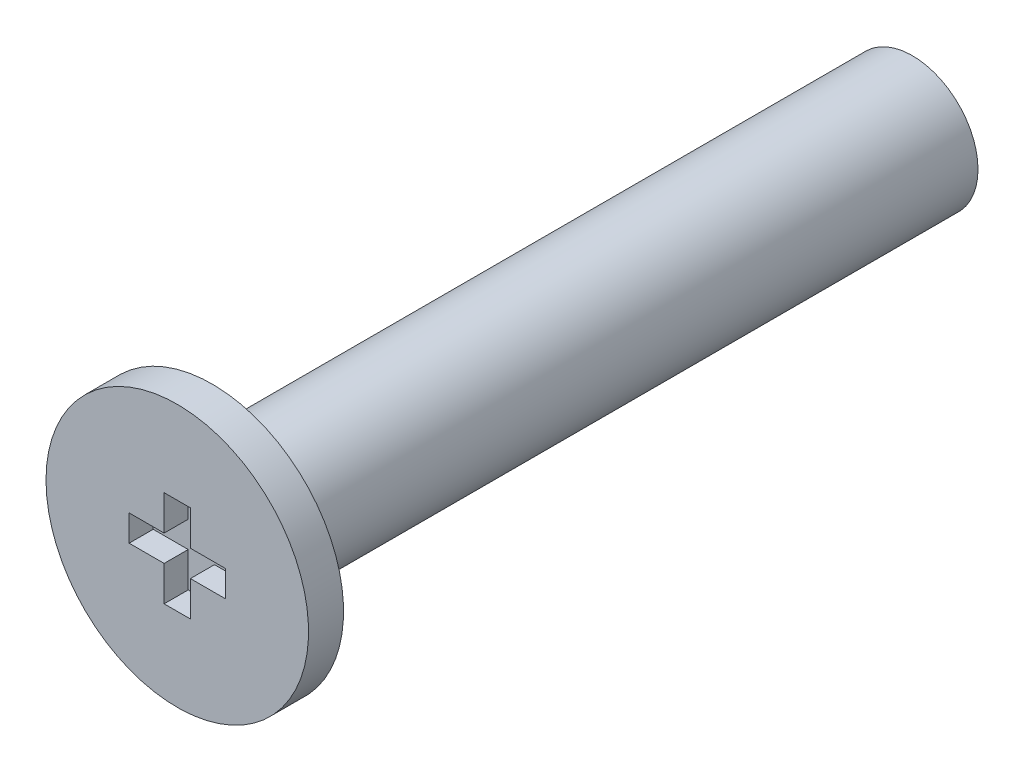
ISO-10303-21;
HEADER;
FILE_DESCRIPTION(('STEP AP214'),'2;1');
FILE_NAME('part.step','',(''),(''),'','','');
FILE_SCHEMA(('AUTOMOTIVE_DESIGN { 1 0 10303 214 1 1 1 1 }'));
ENDSEC;
DATA;
#1=APPLICATION_CONTEXT('core data for automotive mechanical design processes');
#2=APPLICATION_PROTOCOL_DEFINITION('international standard','automotive_design',2000,#1);
#3=PRODUCT_CONTEXT('',#1,'mechanical');
#4=PRODUCT('Part','Part','',(#3));
#5=PRODUCT_RELATED_PRODUCT_CATEGORY('part','',(#4));
#6=PRODUCT_DEFINITION_FORMATION('','',#4);
#7=PRODUCT_DEFINITION_CONTEXT('part definition',#1,'design');
#8=PRODUCT_DEFINITION('design','',#6,#7);
#9=PRODUCT_DEFINITION_SHAPE('','',#8);
#10=(LENGTH_UNIT() NAMED_UNIT(*) SI_UNIT(.MILLI.,.METRE.));
#11=(NAMED_UNIT(*) PLANE_ANGLE_UNIT() SI_UNIT($,.RADIAN.));
#12=(NAMED_UNIT(*) SI_UNIT($,.STERADIAN.) SOLID_ANGLE_UNIT());
#13=UNCERTAINTY_MEASURE_WITH_UNIT(LENGTH_MEASURE(1.E-05),#10,'distance_accuracy_value','');
#14=(GEOMETRIC_REPRESENTATION_CONTEXT(3) GLOBAL_UNCERTAINTY_ASSIGNED_CONTEXT((#13)) GLOBAL_UNIT_ASSIGNED_CONTEXT((#10,
#11,#12)) REPRESENTATION_CONTEXT('',''));
#15=CARTESIAN_POINT('',(0.,0.,0.));
#16=DIRECTION('',(0.,0.,1.));
#17=DIRECTION('',(1.,0.,0.));
#18=AXIS2_PLACEMENT_3D('',#15,#16,#17);
#19=CARTESIAN_POINT('',(0.,0.,-16.));
#20=DIRECTION('',(0.,0.,1.));
#21=DIRECTION('',(1.,0.,0.));
#22=AXIS2_PLACEMENT_3D('',#19,#20,#21);
#23=CYLINDRICAL_SURFACE('',#22,1.5);
#24=CARTESIAN_POINT('',(0.,0.,-16.));
#25=DIRECTION('',(0.,0.,1.));
#26=DIRECTION('',(1.,0.,0.));
#27=AXIS2_PLACEMENT_3D('',#24,#25,#26);
#28=CIRCLE('',#27,1.5);
#29=CARTESIAN_POINT('',(1.5,0.,-16.));
#30=VERTEX_POINT('',#29);
#31=EDGE_CURVE('E212',#30,#30,#28,.T.);
#32=ORIENTED_EDGE('',*,*,#31,.T.);
#33=EDGE_LOOP('',(#32));
#34=FACE_BOUND('',#33,.T.);
#35=CARTESIAN_POINT('',(0.,0.,0.));
#36=DIRECTION('',(0.,0.,1.));
#37=DIRECTION('',(1.,0.,0.));
#38=AXIS2_PLACEMENT_3D('',#35,#36,#37);
#39=CIRCLE('',#38,1.5);
#40=CARTESIAN_POINT('',(1.5,0.,0.));
#41=VERTEX_POINT('',#40);
#42=EDGE_CURVE('E208',#41,#41,#39,.T.);
#43=ORIENTED_EDGE('',*,*,#42,.F.);
#44=EDGE_LOOP('',(#43));
#45=FACE_BOUND('',#44,.T.);
#46=ADVANCED_FACE('F41',(#34,#45),#23,.T.);
#47=CARTESIAN_POINT('',(0.,0.,-16.));
#48=DIRECTION('',(0.,0.,1.));
#49=DIRECTION('',(1.,0.,0.));
#50=AXIS2_PLACEMENT_3D('',#47,#48,#49);
#51=PLANE('',#50);
#52=ORIENTED_EDGE('',*,*,#31,.F.);
#53=EDGE_LOOP('',(#52));
#54=FACE_BOUND('',#53,.T.);
#55=ADVANCED_FACE('F281',(#54),#51,.F.);
#56=CARTESIAN_POINT('',(0.,0.,0.));
#57=DIRECTION('',(0.,0.,1.));
#58=DIRECTION('',(1.,0.,0.));
#59=AXIS2_PLACEMENT_3D('',#56,#57,#58);
#60=PLANE('',#59);
#61=ORIENTED_EDGE('',*,*,#42,.T.);
#62=EDGE_LOOP('',(#61));
#63=FACE_BOUND('',#62,.T.);
#64=CARTESIAN_POINT('',(0.,0.,0.));
#65=DIRECTION('',(0.,0.,-1.));
#66=DIRECTION('',(-1.,0.,0.));
#67=AXIS2_PLACEMENT_3D('',#64,#65,#66);
#68=CIRCLE('',#67,3.);
#69=CARTESIAN_POINT('',(-3.,0.,0.));
#70=VERTEX_POINT('',#69);
#71=EDGE_CURVE('E210',#70,#70,#68,.T.);
#72=ORIENTED_EDGE('',*,*,#71,.T.);
#73=EDGE_LOOP('',(#72));
#74=FACE_BOUND('',#73,.T.);
#75=ADVANCED_FACE('F286',(#63,#74),#60,.F.);
#76=CARTESIAN_POINT('',(0.,0.,-2.));
#77=DIRECTION('',(0.,0.,-1.));
#78=DIRECTION('',(-1.,0.,0.));
#79=AXIS2_PLACEMENT_3D('',#76,#77,#78);
#80=CYLINDRICAL_SURFACE('',#79,3.);
#81=ORIENTED_EDGE('',*,*,#71,.F.);
#82=EDGE_LOOP('',(#81));
#83=FACE_BOUND('',#82,.T.);
#84=CARTESIAN_POINT('',(0.,0.,0.8));
#85=DIRECTION('',(0.,0.,-1.));
#86=DIRECTION('',(-1.,0.,0.));
#87=AXIS2_PLACEMENT_3D('',#84,#85,#86);
#88=CIRCLE('',#87,3.);
#89=CARTESIAN_POINT('',(-3.,0.,0.8));
#90=VERTEX_POINT('',#89);
#91=EDGE_CURVE('E179',#90,#90,#88,.T.);
#92=ORIENTED_EDGE('',*,*,#91,.T.);
#93=EDGE_LOOP('',(#92));
#94=FACE_BOUND('',#93,.T.);
#95=ADVANCED_FACE('F300',(#83,#94),#80,.T.);
#96=CARTESIAN_POINT('',(3.,0.,0.8));
#97=DIRECTION('',(0.,0.,-1.));
#98=DIRECTION('',(-1.,0.,0.));
#99=AXIS2_PLACEMENT_3D('',#96,#97,#98);
#100=PLANE('',#99);
#101=DIRECTION('',(-1.,0.,0.));
#102=VECTOR('',#101,1.);
#103=CARTESIAN_POINT('',(3.,-1.1,0.8));
#104=LINE('',#103,#102);
#105=CARTESIAN_POINT('',(0.3,-1.1,0.8));
#106=VERTEX_POINT('',#105);
#107=CARTESIAN_POINT('',(-0.3,-1.1,0.8));
#108=VERTEX_POINT('',#107);
#109=EDGE_CURVE('E211',#106,#108,#104,.T.);
#110=ORIENTED_EDGE('',*,*,#109,.T.);
#111=DIRECTION('',(0.,1.,0.));
#112=VECTOR('',#111,1.);
#113=CARTESIAN_POINT('',(-0.3,0.,0.8));
#114=LINE('',#113,#112);
#115=CARTESIAN_POINT('',(-0.3,-0.3,0.8));
#116=VERTEX_POINT('',#115);
#117=EDGE_CURVE('E11',#108,#116,#114,.T.);
#118=ORIENTED_EDGE('',*,*,#117,.T.);
#119=DIRECTION('',(-1.,0.,0.));
#120=VECTOR('',#119,1.);
#121=CARTESIAN_POINT('',(3.,-0.3,0.8));
#122=LINE('',#121,#120);
#123=CARTESIAN_POINT('',(-1.1,-0.3,0.8));
#124=VERTEX_POINT('',#123);
#125=EDGE_CURVE('E48',#116,#124,#122,.T.);
#126=ORIENTED_EDGE('',*,*,#125,.T.);
#127=DIRECTION('',(0.,1.,0.));
#128=VECTOR('',#127,1.);
#129=CARTESIAN_POINT('',(-1.1,0.,0.8));
#130=LINE('',#129,#128);
#131=CARTESIAN_POINT('',(-1.1,0.3,0.8));
#132=VERTEX_POINT('',#131);
#133=EDGE_CURVE('E241',#124,#132,#130,.T.);
#134=ORIENTED_EDGE('',*,*,#133,.T.);
#135=DIRECTION('',(1.,0.,0.));
#136=VECTOR('',#135,1.);
#137=CARTESIAN_POINT('',(3.,0.3,0.8));
#138=LINE('',#137,#136);
#139=CARTESIAN_POINT('',(-0.3,0.3,0.8));
#140=VERTEX_POINT('',#139);
#141=EDGE_CURVE('E236',#132,#140,#138,.T.);
#142=ORIENTED_EDGE('',*,*,#141,.T.);
#143=DIRECTION('',(0.,1.,0.));
#144=VECTOR('',#143,1.);
#145=CARTESIAN_POINT('',(-0.3,0.,0.8));
#146=LINE('',#145,#144);
#147=CARTESIAN_POINT('',(-0.3,1.1,0.8));
#148=VERTEX_POINT('',#147);
#149=EDGE_CURVE('E237',#140,#148,#146,.T.);
#150=ORIENTED_EDGE('',*,*,#149,.T.);
#151=DIRECTION('',(1.,0.,0.));
#152=VECTOR('',#151,1.);
#153=CARTESIAN_POINT('',(3.,1.1,0.8));
#154=LINE('',#153,#152);
#155=CARTESIAN_POINT('',(0.3,1.1,0.8));
#156=VERTEX_POINT('',#155);
#157=EDGE_CURVE('E231',#148,#156,#154,.T.);
#158=ORIENTED_EDGE('',*,*,#157,.T.);
#159=DIRECTION('',(0.,-1.,0.));
#160=VECTOR('',#159,1.);
#161=CARTESIAN_POINT('',(0.3,0.,0.8));
#162=LINE('',#161,#160);
#163=CARTESIAN_POINT('',(0.3,0.3,0.8));
#164=VERTEX_POINT('',#163);
#165=EDGE_CURVE('E228',#156,#164,#162,.T.);
#166=ORIENTED_EDGE('',*,*,#165,.T.);
#167=DIRECTION('',(1.,0.,0.));
#168=VECTOR('',#167,1.);
#169=CARTESIAN_POINT('',(3.,0.3,0.8));
#170=LINE('',#169,#168);
#171=CARTESIAN_POINT('',(1.1,0.3,0.8));
#172=VERTEX_POINT('',#171);
#173=EDGE_CURVE('E229',#164,#172,#170,.T.);
#174=ORIENTED_EDGE('',*,*,#173,.T.);
#175=DIRECTION('',(0.,-1.,0.));
#176=VECTOR('',#175,1.);
#177=CARTESIAN_POINT('',(1.1,0.,0.8));
#178=LINE('',#177,#176);
#179=CARTESIAN_POINT('',(1.1,-0.3,0.8));
#180=VERTEX_POINT('',#179);
#181=EDGE_CURVE('E224',#172,#180,#178,.T.);
#182=ORIENTED_EDGE('',*,*,#181,.T.);
#183=DIRECTION('',(-1.,0.,0.));
#184=VECTOR('',#183,1.);
#185=CARTESIAN_POINT('',(3.,-0.3,0.8));
#186=LINE('',#185,#184);
#187=CARTESIAN_POINT('',(0.3,-0.3,0.8));
#188=VERTEX_POINT('',#187);
#189=EDGE_CURVE('E222',#180,#188,#186,.T.);
#190=ORIENTED_EDGE('',*,*,#189,.T.);
#191=DIRECTION('',(0.,-1.,0.));
#192=VECTOR('',#191,1.);
#193=CARTESIAN_POINT('',(0.3,0.,0.8));
#194=LINE('',#193,#192);
#195=EDGE_CURVE('E220',#188,#106,#194,.T.);
#196=ORIENTED_EDGE('',*,*,#195,.T.);
#197=EDGE_LOOP('',(#110,#118,#126,#134,#142,#150,#158,#166,#174,#182,#190,#196));
#198=FACE_BOUND('',#197,.T.);
#199=ORIENTED_EDGE('',*,*,#91,.F.);
#200=EDGE_LOOP('',(#199));
#201=FACE_BOUND('',#200,.T.);
#202=ADVANCED_FACE('F242',(#198,#201),#100,.F.);
#203=CARTESIAN_POINT('',(-0.3,-0.3,0.25));
#204=DIRECTION('',(-1.,0.,0.));
#205=DIRECTION('',(0.,0.,1.));
#206=AXIS2_PLACEMENT_3D('',#203,#204,#205);
#207=PLANE('',#206);
#208=DIRECTION('',(0.,0.,1.));
#209=VECTOR('',#208,1.);
#210=CARTESIAN_POINT('',(-0.3,-1.1,0.25));
#211=LINE('',#210,#209);
#212=CARTESIAN_POINT('',(-0.3,-1.1,0.25));
#213=VERTEX_POINT('',#212);
#214=EDGE_CURVE('E54',#213,#108,#211,.T.);
#215=ORIENTED_EDGE('',*,*,#214,.F.);
#216=DIRECTION('',(0.,-1.,0.));
#217=VECTOR('',#216,1.);
#218=CARTESIAN_POINT('',(-0.3,-0.3,0.25));
#219=LINE('',#218,#217);
#220=CARTESIAN_POINT('',(-0.3,-0.3,0.25));
#221=VERTEX_POINT('',#220);
#222=EDGE_CURVE('E129',#221,#213,#219,.T.);
#223=ORIENTED_EDGE('',*,*,#222,.F.);
#224=DIRECTION('',(0.,0.,1.));
#225=VECTOR('',#224,1.);
#226=CARTESIAN_POINT('',(-0.3,-0.3,0.25));
#227=LINE('',#226,#225);
#228=EDGE_CURVE('E171',#221,#116,#227,.T.);
#229=ORIENTED_EDGE('',*,*,#228,.T.);
#230=ORIENTED_EDGE('',*,*,#117,.F.);
#231=EDGE_LOOP('',(#215,#223,#229,#230));
#232=FACE_BOUND('',#231,.T.);
#233=ADVANCED_FACE('F127',(#232),#207,.F.);
#234=CARTESIAN_POINT('',(-1.1,-0.3,0.25));
#235=DIRECTION('',(0.,-1.,0.));
#236=DIRECTION('',(0.,0.,-1.));
#237=AXIS2_PLACEMENT_3D('',#234,#235,#236);
#238=PLANE('',#237);
#239=ORIENTED_EDGE('',*,*,#228,.F.);
#240=DIRECTION('',(1.,0.,0.));
#241=VECTOR('',#240,1.);
#242=CARTESIAN_POINT('',(-1.1,-0.3,0.25));
#243=LINE('',#242,#241);
#244=CARTESIAN_POINT('',(-1.1,-0.3,0.25));
#245=VERTEX_POINT('',#244);
#246=EDGE_CURVE('E131',#245,#221,#243,.T.);
#247=ORIENTED_EDGE('',*,*,#246,.F.);
#248=DIRECTION('',(0.,0.,1.));
#249=VECTOR('',#248,1.);
#250=CARTESIAN_POINT('',(-1.1,-0.3,0.25));
#251=LINE('',#250,#249);
#252=EDGE_CURVE('E180',#245,#124,#251,.T.);
#253=ORIENTED_EDGE('',*,*,#252,.T.);
#254=ORIENTED_EDGE('',*,*,#125,.F.);
#255=EDGE_LOOP('',(#239,#247,#253,#254));
#256=FACE_BOUND('',#255,.T.);
#257=ADVANCED_FACE('F273',(#256),#238,.F.);
#258=CARTESIAN_POINT('',(-1.1,0.3,0.25));
#259=DIRECTION('',(-1.,0.,0.));
#260=DIRECTION('',(0.,0.,1.));
#261=AXIS2_PLACEMENT_3D('',#258,#259,#260);
#262=PLANE('',#261);
#263=ORIENTED_EDGE('',*,*,#252,.F.);
#264=DIRECTION('',(0.,-1.,0.));
#265=VECTOR('',#264,1.);
#266=CARTESIAN_POINT('',(-1.1,0.3,0.25));
#267=LINE('',#266,#265);
#268=CARTESIAN_POINT('',(-1.1,0.3,0.25));
#269=VERTEX_POINT('',#268);
#270=EDGE_CURVE('E175',#269,#245,#267,.T.);
#271=ORIENTED_EDGE('',*,*,#270,.F.);
#272=DIRECTION('',(0.,0.,1.));
#273=VECTOR('',#272,1.);
#274=CARTESIAN_POINT('',(-1.1,0.3,0.25));
#275=LINE('',#274,#273);
#276=EDGE_CURVE('E178',#269,#132,#275,.T.);
#277=ORIENTED_EDGE('',*,*,#276,.T.);
#278=ORIENTED_EDGE('',*,*,#133,.F.);
#279=EDGE_LOOP('',(#263,#271,#277,#278));
#280=FACE_BOUND('',#279,.T.);
#281=ADVANCED_FACE('F275',(#280),#262,.F.);
#282=CARTESIAN_POINT('',(-0.3,0.3,0.25));
#283=DIRECTION('',(0.,1.,0.));
#284=DIRECTION('',(0.,0.,1.));
#285=AXIS2_PLACEMENT_3D('',#282,#283,#284);
#286=PLANE('',#285);
#287=ORIENTED_EDGE('',*,*,#276,.F.);
#288=DIRECTION('',(-1.,0.,0.));
#289=VECTOR('',#288,1.);
#290=CARTESIAN_POINT('',(-0.3,0.3,0.25));
#291=LINE('',#290,#289);
#292=CARTESIAN_POINT('',(-0.3,0.3,0.25));
#293=VERTEX_POINT('',#292);
#294=EDGE_CURVE('E168',#293,#269,#291,.T.);
#295=ORIENTED_EDGE('',*,*,#294,.F.);
#296=DIRECTION('',(0.,0.,1.));
#297=VECTOR('',#296,1.);
#298=CARTESIAN_POINT('',(-0.3,0.3,0.25));
#299=LINE('',#298,#297);
#300=EDGE_CURVE('E181',#293,#140,#299,.T.);
#301=ORIENTED_EDGE('',*,*,#300,.T.);
#302=ORIENTED_EDGE('',*,*,#141,.F.);
#303=EDGE_LOOP('',(#287,#295,#301,#302));
#304=FACE_BOUND('',#303,.T.);
#305=ADVANCED_FACE('F269',(#304),#286,.F.);
#306=CARTESIAN_POINT('',(-0.3,1.1,0.25));
#307=DIRECTION('',(-1.,0.,0.));
#308=DIRECTION('',(0.,0.,1.));
#309=AXIS2_PLACEMENT_3D('',#306,#307,#308);
#310=PLANE('',#309);
#311=ORIENTED_EDGE('',*,*,#300,.F.);
#312=DIRECTION('',(0.,-1.,0.));
#313=VECTOR('',#312,1.);
#314=CARTESIAN_POINT('',(-0.3,1.1,0.25));
#315=LINE('',#314,#313);
#316=CARTESIAN_POINT('',(-0.3,1.1,0.25));
#317=VERTEX_POINT('',#316);
#318=EDGE_CURVE('E169',#317,#293,#315,.T.);
#319=ORIENTED_EDGE('',*,*,#318,.F.);
#320=DIRECTION('',(0.,0.,1.));
#321=VECTOR('',#320,1.);
#322=CARTESIAN_POINT('',(-0.3,1.1,0.25));
#323=LINE('',#322,#321);
#324=EDGE_CURVE('E188',#317,#148,#323,.T.);
#325=ORIENTED_EDGE('',*,*,#324,.T.);
#326=ORIENTED_EDGE('',*,*,#149,.F.);
#327=EDGE_LOOP('',(#311,#319,#325,#326));
#328=FACE_BOUND('',#327,.T.);
#329=ADVANCED_FACE('F266',(#328),#310,.F.);
#330=CARTESIAN_POINT('',(0.3,1.1,0.25));
#331=DIRECTION('',(0.,1.,0.));
#332=DIRECTION('',(0.,0.,1.));
#333=AXIS2_PLACEMENT_3D('',#330,#331,#332);
#334=PLANE('',#333);
#335=ORIENTED_EDGE('',*,*,#324,.F.);
#336=DIRECTION('',(-1.,0.,0.));
#337=VECTOR('',#336,1.);
#338=CARTESIAN_POINT('',(0.3,1.1,0.25));
#339=LINE('',#338,#337);
#340=CARTESIAN_POINT('',(0.3,1.1,0.25));
#341=VERTEX_POINT('',#340);
#342=EDGE_CURVE('E164',#341,#317,#339,.T.);
#343=ORIENTED_EDGE('',*,*,#342,.F.);
#344=DIRECTION('',(0.,0.,1.));
#345=VECTOR('',#344,1.);
#346=CARTESIAN_POINT('',(0.3,1.1,0.25));
#347=LINE('',#346,#345);
#348=EDGE_CURVE('E189',#341,#156,#347,.T.);
#349=ORIENTED_EDGE('',*,*,#348,.T.);
#350=ORIENTED_EDGE('',*,*,#157,.F.);
#351=EDGE_LOOP('',(#335,#343,#349,#350));
#352=FACE_BOUND('',#351,.T.);
#353=ADVANCED_FACE('F261',(#352),#334,.F.);
#354=CARTESIAN_POINT('',(0.3,0.3,0.25));
#355=DIRECTION('',(1.,0.,0.));
#356=DIRECTION('',(0.,0.,-1.));
#357=AXIS2_PLACEMENT_3D('',#354,#355,#356);
#358=PLANE('',#357);
#359=ORIENTED_EDGE('',*,*,#348,.F.);
#360=DIRECTION('',(0.,1.,0.));
#361=VECTOR('',#360,1.);
#362=CARTESIAN_POINT('',(0.3,0.3,0.25));
#363=LINE('',#362,#361);
#364=CARTESIAN_POINT('',(0.3,0.3,0.25));
#365=VERTEX_POINT('',#364);
#366=EDGE_CURVE('E158',#365,#341,#363,.T.);
#367=ORIENTED_EDGE('',*,*,#366,.F.);
#368=DIRECTION('',(0.,0.,1.));
#369=VECTOR('',#368,1.);
#370=CARTESIAN_POINT('',(0.3,0.3,0.25));
#371=LINE('',#370,#369);
#372=EDGE_CURVE('E195',#365,#164,#371,.T.);
#373=ORIENTED_EDGE('',*,*,#372,.T.);
#374=ORIENTED_EDGE('',*,*,#165,.F.);
#375=EDGE_LOOP('',(#359,#367,#373,#374));
#376=FACE_BOUND('',#375,.T.);
#377=ADVANCED_FACE('F263',(#376),#358,.F.);
#378=CARTESIAN_POINT('',(1.1,0.3,0.25));
#379=DIRECTION('',(0.,1.,0.));
#380=DIRECTION('',(0.,0.,1.));
#381=AXIS2_PLACEMENT_3D('',#378,#379,#380);
#382=PLANE('',#381);
#383=ORIENTED_EDGE('',*,*,#372,.F.);
#384=DIRECTION('',(-1.,0.,0.));
#385=VECTOR('',#384,1.);
#386=CARTESIAN_POINT('',(1.1,0.3,0.25));
#387=LINE('',#386,#385);
#388=CARTESIAN_POINT('',(1.1,0.3,0.25));
#389=VERTEX_POINT('',#388);
#390=EDGE_CURVE('E160',#389,#365,#387,.T.);
#391=ORIENTED_EDGE('',*,*,#390,.F.);
#392=DIRECTION('',(0.,0.,1.));
#393=VECTOR('',#392,1.);
#394=CARTESIAN_POINT('',(1.1,0.3,0.25));
#395=LINE('',#394,#393);
#396=EDGE_CURVE('E194',#389,#172,#395,.T.);
#397=ORIENTED_EDGE('',*,*,#396,.T.);
#398=ORIENTED_EDGE('',*,*,#173,.F.);
#399=EDGE_LOOP('',(#383,#391,#397,#398));
#400=FACE_BOUND('',#399,.T.);
#401=ADVANCED_FACE('F257',(#400),#382,.F.);
#402=CARTESIAN_POINT('',(1.1,-0.3,0.25));
#403=DIRECTION('',(1.,0.,0.));
#404=DIRECTION('',(0.,0.,-1.));
#405=AXIS2_PLACEMENT_3D('',#402,#403,#404);
#406=PLANE('',#405);
#407=ORIENTED_EDGE('',*,*,#396,.F.);
#408=DIRECTION('',(0.,1.,0.));
#409=VECTOR('',#408,1.);
#410=CARTESIAN_POINT('',(1.1,-0.3,0.25));
#411=LINE('',#410,#409);
#412=CARTESIAN_POINT('',(1.1,-0.3,0.25));
#413=VERTEX_POINT('',#412);
#414=EDGE_CURVE('E151',#413,#389,#411,.T.);
#415=ORIENTED_EDGE('',*,*,#414,.F.);
#416=DIRECTION('',(0.,0.,1.));
#417=VECTOR('',#416,1.);
#418=CARTESIAN_POINT('',(1.1,-0.3,0.25));
#419=LINE('',#418,#417);
#420=EDGE_CURVE('E198',#413,#180,#419,.T.);
#421=ORIENTED_EDGE('',*,*,#420,.T.);
#422=ORIENTED_EDGE('',*,*,#181,.F.);
#423=EDGE_LOOP('',(#407,#415,#421,#422));
#424=FACE_BOUND('',#423,.T.);
#425=ADVANCED_FACE('F251',(#424),#406,.F.);
#426=CARTESIAN_POINT('',(0.3,-0.3,0.25));
#427=DIRECTION('',(0.,-1.,0.));
#428=DIRECTION('',(0.,0.,-1.));
#429=AXIS2_PLACEMENT_3D('',#426,#427,#428);
#430=PLANE('',#429);
#431=ORIENTED_EDGE('',*,*,#420,.F.);
#432=DIRECTION('',(1.,0.,0.));
#433=VECTOR('',#432,1.);
#434=CARTESIAN_POINT('',(0.3,-0.3,0.25));
#435=LINE('',#434,#433);
#436=CARTESIAN_POINT('',(0.3,-0.3,0.25));
#437=VERTEX_POINT('',#436);
#438=EDGE_CURVE('E152',#437,#413,#435,.T.);
#439=ORIENTED_EDGE('',*,*,#438,.F.);
#440=DIRECTION('',(0.,0.,1.));
#441=VECTOR('',#440,1.);
#442=CARTESIAN_POINT('',(0.3,-0.3,0.25));
#443=LINE('',#442,#441);
#444=EDGE_CURVE('E201',#437,#188,#443,.T.);
#445=ORIENTED_EDGE('',*,*,#444,.T.);
#446=ORIENTED_EDGE('',*,*,#189,.F.);
#447=EDGE_LOOP('',(#431,#439,#445,#446));
#448=FACE_BOUND('',#447,.T.);
#449=ADVANCED_FACE('F254',(#448),#430,.F.);
#450=CARTESIAN_POINT('',(0.3,-1.1,0.25));
#451=DIRECTION('',(1.,0.,0.));
#452=DIRECTION('',(0.,0.,-1.));
#453=AXIS2_PLACEMENT_3D('',#450,#451,#452);
#454=PLANE('',#453);
#455=ORIENTED_EDGE('',*,*,#444,.F.);
#456=DIRECTION('',(0.,1.,0.));
#457=VECTOR('',#456,1.);
#458=CARTESIAN_POINT('',(0.3,-1.1,0.25));
#459=LINE('',#458,#457);
#460=CARTESIAN_POINT('',(0.3,-1.1,0.25));
#461=VERTEX_POINT('',#460);
#462=EDGE_CURVE('E145',#461,#437,#459,.T.);
#463=ORIENTED_EDGE('',*,*,#462,.F.);
#464=DIRECTION('',(0.,0.,1.));
#465=VECTOR('',#464,1.);
#466=CARTESIAN_POINT('',(0.3,-1.1,0.25));
#467=LINE('',#466,#465);
#468=EDGE_CURVE('E134',#461,#106,#467,.T.);
#469=ORIENTED_EDGE('',*,*,#468,.T.);
#470=ORIENTED_EDGE('',*,*,#195,.F.);
#471=EDGE_LOOP('',(#455,#463,#469,#470));
#472=FACE_BOUND('',#471,.T.);
#473=ADVANCED_FACE('F248',(#472),#454,.F.);
#474=CARTESIAN_POINT('',(-0.3,-1.1,0.25));
#475=DIRECTION('',(0.,-1.,0.));
#476=DIRECTION('',(0.,0.,-1.));
#477=AXIS2_PLACEMENT_3D('',#474,#475,#476);
#478=PLANE('',#477);
#479=ORIENTED_EDGE('',*,*,#468,.F.);
#480=DIRECTION('',(1.,0.,0.));
#481=VECTOR('',#480,1.);
#482=CARTESIAN_POINT('',(-0.3,-1.1,0.25));
#483=LINE('',#482,#481);
#484=EDGE_CURVE('E140',#213,#461,#483,.T.);
#485=ORIENTED_EDGE('',*,*,#484,.F.);
#486=ORIENTED_EDGE('',*,*,#214,.T.);
#487=ORIENTED_EDGE('',*,*,#109,.F.);
#488=EDGE_LOOP('',(#479,#485,#486,#487));
#489=FACE_BOUND('',#488,.T.);
#490=ADVANCED_FACE('F139',(#489),#478,.F.);
#491=CARTESIAN_POINT('',(0.,0.,0.25));
#492=DIRECTION('',(0.,0.,1.));
#493=DIRECTION('',(1.,0.,0.));
#494=AXIS2_PLACEMENT_3D('',#491,#492,#493);
#495=PLANE('',#494);
#496=ORIENTED_EDGE('',*,*,#222,.T.);
#497=ORIENTED_EDGE('',*,*,#484,.T.);
#498=ORIENTED_EDGE('',*,*,#462,.T.);
#499=ORIENTED_EDGE('',*,*,#438,.T.);
#500=ORIENTED_EDGE('',*,*,#414,.T.);
#501=ORIENTED_EDGE('',*,*,#390,.T.);
#502=ORIENTED_EDGE('',*,*,#366,.T.);
#503=ORIENTED_EDGE('',*,*,#342,.T.);
#504=ORIENTED_EDGE('',*,*,#318,.T.);
#505=ORIENTED_EDGE('',*,*,#294,.T.);
#506=ORIENTED_EDGE('',*,*,#270,.T.);
#507=ORIENTED_EDGE('',*,*,#246,.T.);
#508=EDGE_LOOP('',(#496,#497,#498,#499,#500,#501,#502,#503,#504,#505,#506,#507));
#509=FACE_BOUND('',#508,.T.);
#510=ADVANCED_FACE('F142',(#509),#495,.T.);
#511=CLOSED_SHELL('',(#46,#55,#75,#95,#202,#233,#257,#281,#305,#329,#353,#377,#401,#425,#449,
#473,#490,#510));
#512=MANIFOLD_SOLID_BREP('B2',#511);
#513=ADVANCED_BREP_SHAPE_REPRESENTATION('',(#18,#512),#14);
#514=SHAPE_DEFINITION_REPRESENTATION(#9,#513);
ENDSEC;
END-ISO-10303-21;
